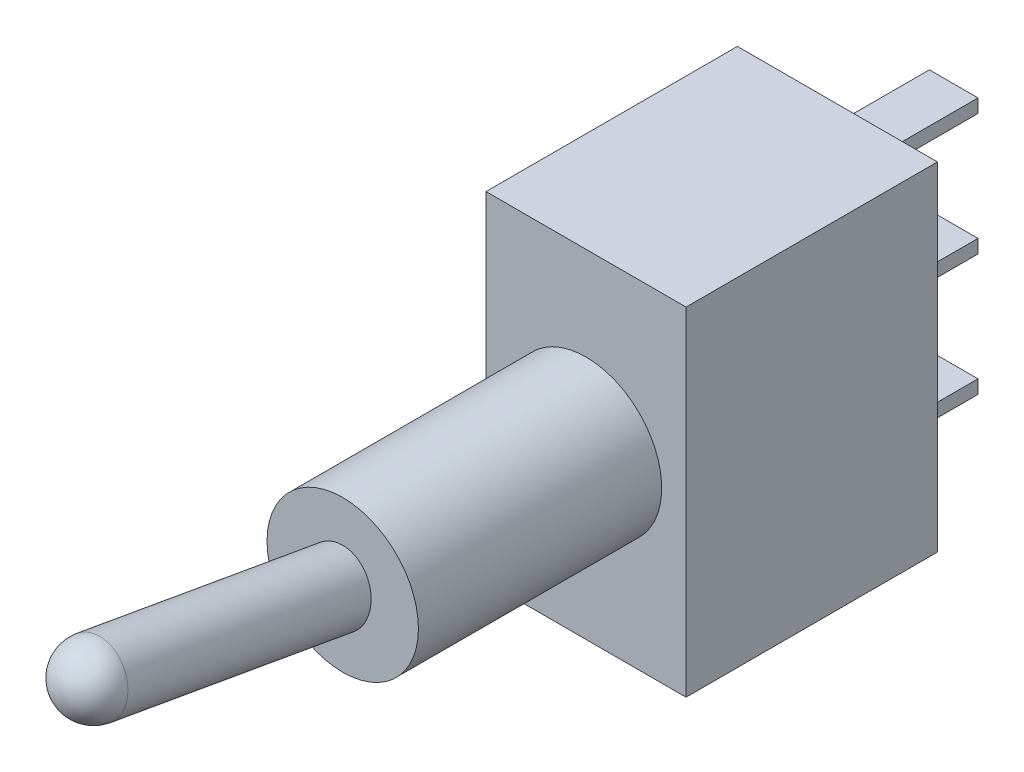
ISO-10303-21;
HEADER;
FILE_DESCRIPTION(('STEP AP214'),'2;1');
FILE_NAME('part.step','',(''),(''),'','','');
FILE_SCHEMA(('AUTOMOTIVE_DESIGN { 1 0 10303 214 1 1 1 1 }'));
ENDSEC;
DATA;
#1=APPLICATION_CONTEXT('core data for automotive mechanical design processes');
#2=APPLICATION_PROTOCOL_DEFINITION('international standard','automotive_design',2000,#1);
#3=PRODUCT_CONTEXT('',#1,'mechanical');
#4=PRODUCT('Part','Part','',(#3));
#5=PRODUCT_RELATED_PRODUCT_CATEGORY('part','',(#4));
#6=PRODUCT_DEFINITION_FORMATION('','',#4);
#7=PRODUCT_DEFINITION_CONTEXT('part definition',#1,'design');
#8=PRODUCT_DEFINITION('design','',#6,#7);
#9=PRODUCT_DEFINITION_SHAPE('','',#8);
#10=(LENGTH_UNIT() NAMED_UNIT(*) SI_UNIT(.MILLI.,.METRE.));
#11=(NAMED_UNIT(*) PLANE_ANGLE_UNIT() SI_UNIT($,.RADIAN.));
#12=(NAMED_UNIT(*) SI_UNIT($,.STERADIAN.) SOLID_ANGLE_UNIT());
#13=UNCERTAINTY_MEASURE_WITH_UNIT(LENGTH_MEASURE(1.E-05),#10,'distance_accuracy_value','');
#14=(GEOMETRIC_REPRESENTATION_CONTEXT(3) GLOBAL_UNCERTAINTY_ASSIGNED_CONTEXT((#13)) GLOBAL_UNIT_ASSIGNED_CONTEXT((#10,
#11,#12)) REPRESENTATION_CONTEXT('',''));
#15=CARTESIAN_POINT('',(0.,0.,0.));
#16=DIRECTION('',(0.,0.,1.));
#17=DIRECTION('',(1.,0.,0.));
#18=AXIS2_PLACEMENT_3D('',#15,#16,#17);
#19=CARTESIAN_POINT('',(3.7,6.25,18.3));
#20=DIRECTION('',(0.,0.173648177666931,0.984807753012208));
#21=DIRECTION('',(0.,-0.984807753012208,0.173648177666931));
#22=AXIS2_PLACEMENT_3D('',#19,#20,#21);
#23=CONICAL_SURFACE('',#22,0.,1.39626340159546);
#24=CARTESIAN_POINT('',(3.7,6.28827357359192,18.5170602220837));
#25=DIRECTION('',(0.,-0.173648177666931,-0.984807753012208));
#26=DIRECTION('',(0.,0.984807753012208,-0.173648177666931));
#27=AXIS2_PLACEMENT_3D('',#24,#25,#26);
#28=CIRCLE('',#27,1.25);
#29=CARTESIAN_POINT('',(3.7,7.51928326485718,18.3));
#30=VERTEX_POINT('',#29);
#31=EDGE_CURVE('E12',#30,#30,#28,.T.);
#32=ORIENTED_EDGE('',*,*,#31,.T.);
#33=EDGE_LOOP('',(#32));
#34=FACE_BOUND('',#33,.T.);
#35=CARTESIAN_POINT('',(3.7,6.25,18.3));
#36=VERTEX_POINT('',#35);
#37=VERTEX_LOOP('',#36);
#38=FACE_BOUND('',#37,.T.);
#39=ADVANCED_FACE('F42',(#34,#38),#23,.T.);
#40=CARTESIAN_POINT('',(3.7,6.25,18.3));
#41=DIRECTION('',(0.,-0.173648177666931,-0.984807753012208));
#42=DIRECTION('',(0.,0.984807753012208,-0.173648177666931));
#43=AXIS2_PLACEMENT_3D('',#40,#41,#42);
#44=CYLINDRICAL_SURFACE('',#43,1.25);
#45=CARTESIAN_POINT('',(3.7,7.87521639996811,27.5170602220837));
#46=DIRECTION('',(0.,-0.173648177666931,-0.984807753012208));
#47=DIRECTION('',(0.,0.984807753012208,-0.173648177666931));
#48=AXIS2_PLACEMENT_3D('',#45,#46,#47);
#49=CIRCLE('',#48,1.25);
#50=CARTESIAN_POINT('',(3.7,9.10622609123337,27.3));
#51=VERTEX_POINT('',#50);
#52=EDGE_CURVE('E48',#51,#51,#49,.T.);
#53=ORIENTED_EDGE('',*,*,#52,.T.);
#54=EDGE_LOOP('',(#53));
#55=FACE_BOUND('',#54,.T.);
#56=ORIENTED_EDGE('',*,*,#31,.F.);
#57=EDGE_LOOP('',(#56));
#58=FACE_BOUND('',#57,.T.);
#59=ADVANCED_FACE('F52',(#55,#58),#44,.T.);
#60=CARTESIAN_POINT('',(3.7,7.87521639996811,27.5170602220837));
#61=DIRECTION('',(0.,-0.173648177666931,-0.984807753012208));
#62=DIRECTION('',(0.,0.984807753012208,-0.173648177666931));
#63=AXIS2_PLACEMENT_3D('',#60,#61,#62);
#64=SPHERICAL_SURFACE('',#63,1.25);
#65=ORIENTED_EDGE('',*,*,#52,.F.);
#66=EDGE_LOOP('',(#65));
#67=FACE_BOUND('',#66,.T.);
#68=ADVANCED_FACE('F57',(#67),#64,.T.);
#69=CLOSED_SHELL('',(#39,#59,#68));
#70=MANIFOLD_SOLID_BREP('B2',#69);
#71=CARTESIAN_POINT('',(0.,0.,9.3));
#72=DIRECTION('',(0.,0.,-1.));
#73=DIRECTION('',(-1.,0.,0.));
#74=AXIS2_PLACEMENT_3D('',#71,#72,#73);
#75=PLANE('',#74);
#76=DIRECTION('',(0.,-1.,0.));
#77=VECTOR('',#76,1.);
#78=CARTESIAN_POINT('',(0.,0.,9.3));
#79=LINE('',#78,#77);
#80=CARTESIAN_POINT('',(0.,12.5,9.3));
#81=VERTEX_POINT('',#80);
#82=CARTESIAN_POINT('',(0.,0.,9.3));
#83=VERTEX_POINT('',#82);
#84=EDGE_CURVE('E284',#81,#83,#79,.T.);
#85=ORIENTED_EDGE('',*,*,#84,.T.);
#86=DIRECTION('',(1.,0.,0.));
#87=VECTOR('',#86,1.);
#88=CARTESIAN_POINT('',(0.,0.,9.3));
#89=LINE('',#88,#87);
#90=CARTESIAN_POINT('',(7.4,0.,9.3));
#91=VERTEX_POINT('',#90);
#92=EDGE_CURVE('E287',#83,#91,#89,.T.);
#93=ORIENTED_EDGE('',*,*,#92,.T.);
#94=DIRECTION('',(0.,1.,0.));
#95=VECTOR('',#94,1.);
#96=CARTESIAN_POINT('',(7.4,0.,9.3));
#97=LINE('',#96,#95);
#98=CARTESIAN_POINT('',(7.4,12.5,9.3));
#99=VERTEX_POINT('',#98);
#100=EDGE_CURVE('E290',#91,#99,#97,.T.);
#101=ORIENTED_EDGE('',*,*,#100,.T.);
#102=DIRECTION('',(-1.,0.,0.));
#103=VECTOR('',#102,1.);
#104=CARTESIAN_POINT('',(0.,12.5,9.3));
#105=LINE('',#104,#103);
#106=EDGE_CURVE('E292',#99,#81,#105,.T.);
#107=ORIENTED_EDGE('',*,*,#106,.T.);
#108=EDGE_LOOP('',(#85,#93,#101,#107));
#109=FACE_BOUND('',#108,.T.);
#110=CARTESIAN_POINT('',(3.7,6.25,9.3));
#111=DIRECTION('',(0.,0.,-1.));
#112=DIRECTION('',(-1.,0.,0.));
#113=AXIS2_PLACEMENT_3D('',#110,#111,#112);
#114=CIRCLE('',#113,2.8);
#115=CARTESIAN_POINT('',(0.9,6.25,9.3));
#116=VERTEX_POINT('',#115);
#117=EDGE_CURVE('E40',#116,#116,#114,.F.);
#118=ORIENTED_EDGE('',*,*,#117,.F.);
#119=EDGE_LOOP('',(#118));
#120=FACE_BOUND('',#119,.T.);
#121=ADVANCED_FACE('F84',(#109,#120),#75,.F.);
#122=CARTESIAN_POINT('',(0.,0.,0.));
#123=DIRECTION('',(0.,0.,-1.));
#124=DIRECTION('',(-1.,0.,0.));
#125=AXIS2_PLACEMENT_3D('',#122,#123,#124);
#126=PLANE('',#125);
#127=DIRECTION('',(1.,0.,0.));
#128=VECTOR('',#127,1.);
#129=CARTESIAN_POINT('',(2.8,6.5,0.));
#130=LINE('',#129,#128);
#131=CARTESIAN_POINT('',(2.8,6.5,0.));
#132=VERTEX_POINT('',#131);
#133=CARTESIAN_POINT('',(4.6,6.5,0.));
#134=VERTEX_POINT('',#133);
#135=EDGE_CURVE('E226',#132,#134,#130,.T.);
#136=ORIENTED_EDGE('',*,*,#135,.F.);
#137=DIRECTION('',(0.,1.,0.));
#138=VECTOR('',#137,1.);
#139=CARTESIAN_POINT('',(2.8,6.,0.));
#140=LINE('',#139,#138);
#141=CARTESIAN_POINT('',(2.8,6.,0.));
#142=VERTEX_POINT('',#141);
#143=EDGE_CURVE('E223',#142,#132,#140,.T.);
#144=ORIENTED_EDGE('',*,*,#143,.F.);
#145=DIRECTION('',(-1.,0.,0.));
#146=VECTOR('',#145,1.);
#147=CARTESIAN_POINT('',(2.8,6.,0.));
#148=LINE('',#147,#146);
#149=CARTESIAN_POINT('',(4.6,6.,0.));
#150=VERTEX_POINT('',#149);
#151=EDGE_CURVE('E235',#150,#142,#148,.T.);
#152=ORIENTED_EDGE('',*,*,#151,.F.);
#153=DIRECTION('',(0.,-1.,0.));
#154=VECTOR('',#153,1.);
#155=CARTESIAN_POINT('',(4.6,6.,0.));
#156=LINE('',#155,#154);
#157=EDGE_CURVE('E243',#134,#150,#156,.T.);
#158=ORIENTED_EDGE('',*,*,#157,.F.);
#159=EDGE_LOOP('',(#136,#144,#152,#158));
#160=FACE_BOUND('',#159,.T.);
#161=DIRECTION('',(0.,-1.,0.));
#162=VECTOR('',#161,1.);
#163=CARTESIAN_POINT('',(0.,0.,0.));
#164=LINE('',#163,#162);
#165=CARTESIAN_POINT('',(0.,12.5,0.));
#166=VERTEX_POINT('',#165);
#167=CARTESIAN_POINT('',(0.,0.,0.));
#168=VERTEX_POINT('',#167);
#169=EDGE_CURVE('E283',#166,#168,#164,.T.);
#170=ORIENTED_EDGE('',*,*,#169,.F.);
#171=DIRECTION('',(-1.,0.,0.));
#172=VECTOR('',#171,1.);
#173=CARTESIAN_POINT('',(0.,12.5,0.));
#174=LINE('',#173,#172);
#175=CARTESIAN_POINT('',(7.4,12.5,0.));
#176=VERTEX_POINT('',#175);
#177=EDGE_CURVE('E288',#176,#166,#174,.T.);
#178=ORIENTED_EDGE('',*,*,#177,.F.);
#179=DIRECTION('',(0.,1.,0.));
#180=VECTOR('',#179,1.);
#181=CARTESIAN_POINT('',(7.4,0.,0.));
#182=LINE('',#181,#180);
#183=CARTESIAN_POINT('',(7.4,0.,0.));
#184=VERTEX_POINT('',#183);
#185=EDGE_CURVE('E299',#184,#176,#182,.T.);
#186=ORIENTED_EDGE('',*,*,#185,.F.);
#187=DIRECTION('',(1.,0.,0.));
#188=VECTOR('',#187,1.);
#189=CARTESIAN_POINT('',(0.,0.,0.));
#190=LINE('',#189,#188);
#191=EDGE_CURVE('E297',#168,#184,#190,.T.);
#192=ORIENTED_EDGE('',*,*,#191,.F.);
#193=EDGE_LOOP('',(#170,#178,#186,#192));
#194=FACE_BOUND('',#193,.T.);
#195=DIRECTION('',(1.,0.,0.));
#196=VECTOR('',#195,1.);
#197=CARTESIAN_POINT('',(2.8,2.,0.));
#198=LINE('',#197,#196);
#199=CARTESIAN_POINT('',(2.8,2.,0.));
#200=VERTEX_POINT('',#199);
#201=CARTESIAN_POINT('',(4.6,2.,0.));
#202=VERTEX_POINT('',#201);
#203=EDGE_CURVE('E268',#200,#202,#198,.T.);
#204=ORIENTED_EDGE('',*,*,#203,.F.);
#205=DIRECTION('',(0.,1.,0.));
#206=VECTOR('',#205,1.);
#207=CARTESIAN_POINT('',(2.8,1.5,0.));
#208=LINE('',#207,#206);
#209=CARTESIAN_POINT('',(2.8,1.5,0.));
#210=VERTEX_POINT('',#209);
#211=EDGE_CURVE('E254',#210,#200,#208,.T.);
#212=ORIENTED_EDGE('',*,*,#211,.F.);
#213=DIRECTION('',(-1.,0.,0.));
#214=VECTOR('',#213,1.);
#215=CARTESIAN_POINT('',(2.8,1.5,0.));
#216=LINE('',#215,#214);
#217=CARTESIAN_POINT('',(4.6,1.5,0.));
#218=VERTEX_POINT('',#217);
#219=EDGE_CURVE('E259',#218,#210,#216,.T.);
#220=ORIENTED_EDGE('',*,*,#219,.F.);
#221=DIRECTION('',(0.,-1.,0.));
#222=VECTOR('',#221,1.);
#223=CARTESIAN_POINT('',(4.6,1.5,0.));
#224=LINE('',#223,#222);
#225=EDGE_CURVE('E270',#202,#218,#224,.T.);
#226=ORIENTED_EDGE('',*,*,#225,.F.);
#227=EDGE_LOOP('',(#204,#212,#220,#226));
#228=FACE_BOUND('',#227,.T.);
#229=DIRECTION('',(1.,0.,0.));
#230=VECTOR('',#229,1.);
#231=CARTESIAN_POINT('',(2.8,11.,0.));
#232=LINE('',#231,#230);
#233=CARTESIAN_POINT('',(2.8,11.,0.));
#234=VERTEX_POINT('',#233);
#235=CARTESIAN_POINT('',(4.6,11.,0.));
#236=VERTEX_POINT('',#235);
#237=EDGE_CURVE('E566',#234,#236,#232,.T.);
#238=ORIENTED_EDGE('',*,*,#237,.F.);
#239=DIRECTION('',(0.,1.,0.));
#240=VECTOR('',#239,1.);
#241=CARTESIAN_POINT('',(2.8,10.5,0.));
#242=LINE('',#241,#240);
#243=CARTESIAN_POINT('',(2.8,10.5,0.));
#244=VERTEX_POINT('',#243);
#245=EDGE_CURVE('E221',#244,#234,#242,.T.);
#246=ORIENTED_EDGE('',*,*,#245,.F.);
#247=DIRECTION('',(-1.,0.,0.));
#248=VECTOR('',#247,1.);
#249=CARTESIAN_POINT('',(2.8,10.5,0.));
#250=LINE('',#249,#248);
#251=CARTESIAN_POINT('',(4.6,10.5,0.));
#252=VERTEX_POINT('',#251);
#253=EDGE_CURVE('E217',#252,#244,#250,.T.);
#254=ORIENTED_EDGE('',*,*,#253,.F.);
#255=DIRECTION('',(0.,-1.,0.));
#256=VECTOR('',#255,1.);
#257=CARTESIAN_POINT('',(4.6,10.5,0.));
#258=LINE('',#257,#256);
#259=EDGE_CURVE('E568',#236,#252,#258,.T.);
#260=ORIENTED_EDGE('',*,*,#259,.F.);
#261=EDGE_LOOP('',(#238,#246,#254,#260));
#262=FACE_BOUND('',#261,.T.);
#263=ADVANCED_FACE('F320',(#160,#194,#228,#262),#126,.T.);
#264=CARTESIAN_POINT('',(0.,0.,9.3));
#265=DIRECTION('',(1.,0.,0.));
#266=DIRECTION('',(0.,0.,-1.));
#267=AXIS2_PLACEMENT_3D('',#264,#265,#266);
#268=PLANE('',#267);
#269=ORIENTED_EDGE('',*,*,#169,.T.);
#270=DIRECTION('',(0.,0.,-1.));
#271=VECTOR('',#270,1.);
#272=CARTESIAN_POINT('',(0.,0.,9.3));
#273=LINE('',#272,#271);
#274=EDGE_CURVE('E92',#83,#168,#273,.T.);
#275=ORIENTED_EDGE('',*,*,#274,.F.);
#276=ORIENTED_EDGE('',*,*,#84,.F.);
#277=DIRECTION('',(0.,0.,-1.));
#278=VECTOR('',#277,1.);
#279=CARTESIAN_POINT('',(0.,12.5,9.3));
#280=LINE('',#279,#278);
#281=EDGE_CURVE('E294',#81,#166,#280,.T.);
#282=ORIENTED_EDGE('',*,*,#281,.T.);
#283=EDGE_LOOP('',(#269,#275,#276,#282));
#284=FACE_BOUND('',#283,.T.);
#285=ADVANCED_FACE('F86',(#284),#268,.F.);
#286=CARTESIAN_POINT('',(0.,0.,9.3));
#287=DIRECTION('',(0.,1.,0.));
#288=DIRECTION('',(0.,0.,1.));
#289=AXIS2_PLACEMENT_3D('',#286,#287,#288);
#290=PLANE('',#289);
#291=ORIENTED_EDGE('',*,*,#191,.T.);
#292=DIRECTION('',(0.,0.,-1.));
#293=VECTOR('',#292,1.);
#294=CARTESIAN_POINT('',(7.4,0.,9.3));
#295=LINE('',#294,#293);
#296=EDGE_CURVE('E307',#91,#184,#295,.T.);
#297=ORIENTED_EDGE('',*,*,#296,.F.);
#298=ORIENTED_EDGE('',*,*,#92,.F.);
#299=ORIENTED_EDGE('',*,*,#274,.T.);
#300=EDGE_LOOP('',(#291,#297,#298,#299));
#301=FACE_BOUND('',#300,.T.);
#302=ADVANCED_FACE('F312',(#301),#290,.F.);
#303=CARTESIAN_POINT('',(7.4,0.,9.3));
#304=DIRECTION('',(-1.,0.,0.));
#305=DIRECTION('',(0.,0.,1.));
#306=AXIS2_PLACEMENT_3D('',#303,#304,#305);
#307=PLANE('',#306);
#308=ORIENTED_EDGE('',*,*,#185,.T.);
#309=DIRECTION('',(0.,0.,-1.));
#310=VECTOR('',#309,1.);
#311=CARTESIAN_POINT('',(7.4,12.5,9.3));
#312=LINE('',#311,#310);
#313=EDGE_CURVE('E304',#99,#176,#312,.T.);
#314=ORIENTED_EDGE('',*,*,#313,.F.);
#315=ORIENTED_EDGE('',*,*,#100,.F.);
#316=ORIENTED_EDGE('',*,*,#296,.T.);
#317=EDGE_LOOP('',(#308,#314,#315,#316));
#318=FACE_BOUND('',#317,.T.);
#319=ADVANCED_FACE('F325',(#318),#307,.F.);
#320=CARTESIAN_POINT('',(0.,12.5,9.3));
#321=DIRECTION('',(0.,-1.,0.));
#322=DIRECTION('',(0.,0.,-1.));
#323=AXIS2_PLACEMENT_3D('',#320,#321,#322);
#324=PLANE('',#323);
#325=ORIENTED_EDGE('',*,*,#177,.T.);
#326=ORIENTED_EDGE('',*,*,#281,.F.);
#327=ORIENTED_EDGE('',*,*,#106,.F.);
#328=ORIENTED_EDGE('',*,*,#313,.T.);
#329=EDGE_LOOP('',(#325,#326,#327,#328));
#330=FACE_BOUND('',#329,.T.);
#331=ADVANCED_FACE('F329',(#330),#324,.F.);
#332=CARTESIAN_POINT('',(2.8,1.5,-4.3));
#333=DIRECTION('',(1.,0.,0.));
#334=DIRECTION('',(0.,1.,0.));
#335=AXIS2_PLACEMENT_3D('',#332,#333,#334);
#336=PLANE('',#335);
#337=ORIENTED_EDGE('',*,*,#211,.T.);
#338=DIRECTION('',(0.,0.,1.));
#339=VECTOR('',#338,1.);
#340=CARTESIAN_POINT('',(2.8,2.,-4.3));
#341=LINE('',#340,#339);
#342=CARTESIAN_POINT('',(2.8,2.,-4.3));
#343=VERTEX_POINT('',#342);
#344=EDGE_CURVE('E281',#343,#200,#341,.T.);
#345=ORIENTED_EDGE('',*,*,#344,.F.);
#346=DIRECTION('',(0.,1.,0.));
#347=VECTOR('',#346,1.);
#348=CARTESIAN_POINT('',(2.8,1.5,-4.3));
#349=LINE('',#348,#347);
#350=CARTESIAN_POINT('',(2.8,1.5,-4.3));
#351=VERTEX_POINT('',#350);
#352=EDGE_CURVE('E255',#351,#343,#349,.T.);
#353=ORIENTED_EDGE('',*,*,#352,.F.);
#354=DIRECTION('',(0.,0.,1.));
#355=VECTOR('',#354,1.);
#356=CARTESIAN_POINT('',(2.8,1.5,-4.3));
#357=LINE('',#356,#355);
#358=EDGE_CURVE('E265',#351,#210,#357,.T.);
#359=ORIENTED_EDGE('',*,*,#358,.T.);
#360=EDGE_LOOP('',(#337,#345,#353,#359));
#361=FACE_BOUND('',#360,.T.);
#362=ADVANCED_FACE('F395',(#361),#336,.F.);
#363=CARTESIAN_POINT('',(2.8,2.,-4.3));
#364=DIRECTION('',(0.,-1.,0.));
#365=DIRECTION('',(1.,0.,0.));
#366=AXIS2_PLACEMENT_3D('',#363,#364,#365);
#367=PLANE('',#366);
#368=ORIENTED_EDGE('',*,*,#203,.T.);
#369=DIRECTION('',(0.,0.,1.));
#370=VECTOR('',#369,1.);
#371=CARTESIAN_POINT('',(4.6,2.,-4.3));
#372=LINE('',#371,#370);
#373=CARTESIAN_POINT('',(4.6,2.,-4.3));
#374=VERTEX_POINT('',#373);
#375=EDGE_CURVE('E278',#374,#202,#372,.T.);
#376=ORIENTED_EDGE('',*,*,#375,.F.);
#377=DIRECTION('',(1.,0.,0.));
#378=VECTOR('',#377,1.);
#379=CARTESIAN_POINT('',(2.8,2.,-4.3));
#380=LINE('',#379,#378);
#381=EDGE_CURVE('E258',#343,#374,#380,.T.);
#382=ORIENTED_EDGE('',*,*,#381,.F.);
#383=ORIENTED_EDGE('',*,*,#344,.T.);
#384=EDGE_LOOP('',(#368,#376,#382,#383));
#385=FACE_BOUND('',#384,.T.);
#386=ADVANCED_FACE('F391',(#385),#367,.F.);
#387=CARTESIAN_POINT('',(4.6,1.5,-4.3));
#388=DIRECTION('',(-1.,0.,0.));
#389=DIRECTION('',(0.,-1.,0.));
#390=AXIS2_PLACEMENT_3D('',#387,#388,#389);
#391=PLANE('',#390);
#392=ORIENTED_EDGE('',*,*,#225,.T.);
#393=DIRECTION('',(0.,0.,1.));
#394=VECTOR('',#393,1.);
#395=CARTESIAN_POINT('',(4.6,1.5,-4.3));
#396=LINE('',#395,#394);
#397=CARTESIAN_POINT('',(4.6,1.5,-4.3));
#398=VERTEX_POINT('',#397);
#399=EDGE_CURVE('E276',#398,#218,#396,.T.);
#400=ORIENTED_EDGE('',*,*,#399,.F.);
#401=DIRECTION('',(0.,-1.,0.));
#402=VECTOR('',#401,1.);
#403=CARTESIAN_POINT('',(4.6,1.5,-4.3));
#404=LINE('',#403,#402);
#405=EDGE_CURVE('E261',#374,#398,#404,.T.);
#406=ORIENTED_EDGE('',*,*,#405,.F.);
#407=ORIENTED_EDGE('',*,*,#375,.T.);
#408=EDGE_LOOP('',(#392,#400,#406,#407));
#409=FACE_BOUND('',#408,.T.);
#410=ADVANCED_FACE('F387',(#409),#391,.F.);
#411=CARTESIAN_POINT('',(2.8,1.5,-4.3));
#412=DIRECTION('',(0.,1.,0.));
#413=DIRECTION('',(-1.,0.,0.));
#414=AXIS2_PLACEMENT_3D('',#411,#412,#413);
#415=PLANE('',#414);
#416=ORIENTED_EDGE('',*,*,#219,.T.);
#417=ORIENTED_EDGE('',*,*,#358,.F.);
#418=DIRECTION('',(-1.,0.,0.));
#419=VECTOR('',#418,1.);
#420=CARTESIAN_POINT('',(2.8,1.5,-4.3));
#421=LINE('',#420,#419);
#422=EDGE_CURVE('E263',#398,#351,#421,.T.);
#423=ORIENTED_EDGE('',*,*,#422,.F.);
#424=ORIENTED_EDGE('',*,*,#399,.T.);
#425=EDGE_LOOP('',(#416,#417,#423,#424));
#426=FACE_BOUND('',#425,.T.);
#427=ADVANCED_FACE('F383',(#426),#415,.F.);
#428=CARTESIAN_POINT('',(0.,0.,-4.3));
#429=DIRECTION('',(0.,0.,-1.));
#430=DIRECTION('',(-1.,0.,0.));
#431=AXIS2_PLACEMENT_3D('',#428,#429,#430);
#432=PLANE('',#431);
#433=ORIENTED_EDGE('',*,*,#352,.T.);
#434=ORIENTED_EDGE('',*,*,#381,.T.);
#435=ORIENTED_EDGE('',*,*,#405,.T.);
#436=ORIENTED_EDGE('',*,*,#422,.T.);
#437=EDGE_LOOP('',(#433,#434,#435,#436));
#438=FACE_BOUND('',#437,.T.);
#439=ADVANCED_FACE('F379',(#438),#432,.T.);
#440=CARTESIAN_POINT('',(2.8,6.,-4.3));
#441=DIRECTION('',(1.,0.,0.));
#442=DIRECTION('',(0.,0.,-1.));
#443=AXIS2_PLACEMENT_3D('',#440,#441,#442);
#444=PLANE('',#443);
#445=ORIENTED_EDGE('',*,*,#143,.T.);
#446=DIRECTION('',(0.,0.,1.));
#447=VECTOR('',#446,1.);
#448=CARTESIAN_POINT('',(2.8,6.5,-4.3));
#449=LINE('',#448,#447);
#450=CARTESIAN_POINT('',(2.8,6.5,-4.3));
#451=VERTEX_POINT('',#450);
#452=EDGE_CURVE('E252',#451,#132,#449,.T.);
#453=ORIENTED_EDGE('',*,*,#452,.F.);
#454=DIRECTION('',(0.,1.,0.));
#455=VECTOR('',#454,1.);
#456=CARTESIAN_POINT('',(2.8,6.,-4.3));
#457=LINE('',#456,#455);
#458=CARTESIAN_POINT('',(2.8,6.,-4.3));
#459=VERTEX_POINT('',#458);
#460=EDGE_CURVE('E231',#459,#451,#457,.T.);
#461=ORIENTED_EDGE('',*,*,#460,.F.);
#462=DIRECTION('',(0.,0.,1.));
#463=VECTOR('',#462,1.);
#464=CARTESIAN_POINT('',(2.8,6.,-4.3));
#465=LINE('',#464,#463);
#466=EDGE_CURVE('E240',#459,#142,#465,.T.);
#467=ORIENTED_EDGE('',*,*,#466,.T.);
#468=EDGE_LOOP('',(#445,#453,#461,#467));
#469=FACE_BOUND('',#468,.T.);
#470=ADVANCED_FACE('F375',(#469),#444,.F.);
#471=CARTESIAN_POINT('',(2.8,6.5,-4.3));
#472=DIRECTION('',(0.,-1.,0.));
#473=DIRECTION('',(0.,0.,-1.));
#474=AXIS2_PLACEMENT_3D('',#471,#472,#473);
#475=PLANE('',#474);
#476=ORIENTED_EDGE('',*,*,#135,.T.);
#477=DIRECTION('',(0.,0.,1.));
#478=VECTOR('',#477,1.);
#479=CARTESIAN_POINT('',(4.6,6.5,-4.3));
#480=LINE('',#479,#478);
#481=CARTESIAN_POINT('',(4.6,6.5,-4.3));
#482=VERTEX_POINT('',#481);
#483=EDGE_CURVE('E249',#482,#134,#480,.T.);
#484=ORIENTED_EDGE('',*,*,#483,.F.);
#485=DIRECTION('',(1.,0.,0.));
#486=VECTOR('',#485,1.);
#487=CARTESIAN_POINT('',(2.8,6.5,-4.3));
#488=LINE('',#487,#486);
#489=EDGE_CURVE('E234',#451,#482,#488,.T.);
#490=ORIENTED_EDGE('',*,*,#489,.F.);
#491=ORIENTED_EDGE('',*,*,#452,.T.);
#492=EDGE_LOOP('',(#476,#484,#490,#491));
#493=FACE_BOUND('',#492,.T.);
#494=ADVANCED_FACE('F371',(#493),#475,.F.);
#495=CARTESIAN_POINT('',(4.6,6.,-4.3));
#496=DIRECTION('',(-1.,0.,0.));
#497=DIRECTION('',(0.,0.,1.));
#498=AXIS2_PLACEMENT_3D('',#495,#496,#497);
#499=PLANE('',#498);
#500=ORIENTED_EDGE('',*,*,#157,.T.);
#501=DIRECTION('',(0.,0.,1.));
#502=VECTOR('',#501,1.);
#503=CARTESIAN_POINT('',(4.6,6.,-4.3));
#504=LINE('',#503,#502);
#505=CARTESIAN_POINT('',(4.6,6.,-4.3));
#506=VERTEX_POINT('',#505);
#507=EDGE_CURVE('E107',#506,#150,#504,.T.);
#508=ORIENTED_EDGE('',*,*,#507,.F.);
#509=DIRECTION('',(0.,-1.,0.));
#510=VECTOR('',#509,1.);
#511=CARTESIAN_POINT('',(4.6,6.,-4.3));
#512=LINE('',#511,#510);
#513=EDGE_CURVE('E237',#482,#506,#512,.T.);
#514=ORIENTED_EDGE('',*,*,#513,.F.);
#515=ORIENTED_EDGE('',*,*,#483,.T.);
#516=EDGE_LOOP('',(#500,#508,#514,#515));
#517=FACE_BOUND('',#516,.T.);
#518=ADVANCED_FACE('F368',(#517),#499,.F.);
#519=CARTESIAN_POINT('',(2.8,6.,-4.3));
#520=DIRECTION('',(0.,1.,0.));
#521=DIRECTION('',(0.,0.,1.));
#522=AXIS2_PLACEMENT_3D('',#519,#520,#521);
#523=PLANE('',#522);
#524=ORIENTED_EDGE('',*,*,#151,.T.);
#525=ORIENTED_EDGE('',*,*,#466,.F.);
#526=DIRECTION('',(-1.,0.,0.));
#527=VECTOR('',#526,1.);
#528=CARTESIAN_POINT('',(2.8,6.,-4.3));
#529=LINE('',#528,#527);
#530=EDGE_CURVE('E239',#506,#459,#529,.T.);
#531=ORIENTED_EDGE('',*,*,#530,.F.);
#532=ORIENTED_EDGE('',*,*,#507,.T.);
#533=EDGE_LOOP('',(#524,#525,#531,#532));
#534=FACE_BOUND('',#533,.T.);
#535=ADVANCED_FACE('F364',(#534),#523,.F.);
#536=CARTESIAN_POINT('',(0.,0.,-4.3));
#537=DIRECTION('',(0.,0.,-1.));
#538=DIRECTION('',(-1.,0.,0.));
#539=AXIS2_PLACEMENT_3D('',#536,#537,#538);
#540=PLANE('',#539);
#541=ORIENTED_EDGE('',*,*,#460,.T.);
#542=ORIENTED_EDGE('',*,*,#489,.T.);
#543=ORIENTED_EDGE('',*,*,#513,.T.);
#544=ORIENTED_EDGE('',*,*,#530,.T.);
#545=EDGE_LOOP('',(#541,#542,#543,#544));
#546=FACE_BOUND('',#545,.T.);
#547=ADVANCED_FACE('F361',(#546),#540,.T.);
#548=CARTESIAN_POINT('',(2.8,10.5,-4.3));
#549=DIRECTION('',(1.,0.,0.));
#550=DIRECTION('',(0.,0.,-1.));
#551=AXIS2_PLACEMENT_3D('',#548,#549,#550);
#552=PLANE('',#551);
#553=ORIENTED_EDGE('',*,*,#245,.T.);
#554=DIRECTION('',(0.,0.,1.));
#555=VECTOR('',#554,1.);
#556=CARTESIAN_POINT('',(2.8,11.,-4.3));
#557=LINE('',#556,#555);
#558=CARTESIAN_POINT('',(2.8,11.,-4.3));
#559=VERTEX_POINT('',#558);
#560=EDGE_CURVE('E202',#559,#234,#557,.T.);
#561=ORIENTED_EDGE('',*,*,#560,.F.);
#562=DIRECTION('',(0.,1.,0.));
#563=VECTOR('',#562,1.);
#564=CARTESIAN_POINT('',(2.8,10.5,-4.3));
#565=LINE('',#564,#563);
#566=CARTESIAN_POINT('',(2.8,10.5,-4.3));
#567=VERTEX_POINT('',#566);
#568=EDGE_CURVE('E209',#567,#559,#565,.T.);
#569=ORIENTED_EDGE('',*,*,#568,.F.);
#570=DIRECTION('',(0.,0.,1.));
#571=VECTOR('',#570,1.);
#572=CARTESIAN_POINT('',(2.8,10.5,-4.3));
#573=LINE('',#572,#571);
#574=EDGE_CURVE('E576',#567,#244,#573,.T.);
#575=ORIENTED_EDGE('',*,*,#574,.T.);
#576=EDGE_LOOP('',(#553,#561,#569,#575));
#577=FACE_BOUND('',#576,.T.);
#578=ADVANCED_FACE('F219',(#577),#552,.F.);
#579=CARTESIAN_POINT('',(2.8,11.,-4.3));
#580=DIRECTION('',(0.,-1.,0.));
#581=DIRECTION('',(0.,0.,-1.));
#582=AXIS2_PLACEMENT_3D('',#579,#580,#581);
#583=PLANE('',#582);
#584=ORIENTED_EDGE('',*,*,#237,.T.);
#585=DIRECTION('',(0.,0.,1.));
#586=VECTOR('',#585,1.);
#587=CARTESIAN_POINT('',(4.6,11.,-4.3));
#588=LINE('',#587,#586);
#589=CARTESIAN_POINT('',(4.6,11.,-4.3));
#590=VERTEX_POINT('',#589);
#591=EDGE_CURVE('E205',#590,#236,#588,.T.);
#592=ORIENTED_EDGE('',*,*,#591,.F.);
#593=DIRECTION('',(1.,0.,0.));
#594=VECTOR('',#593,1.);
#595=CARTESIAN_POINT('',(2.8,11.,-4.3));
#596=LINE('',#595,#594);
#597=EDGE_CURVE('E198',#559,#590,#596,.T.);
#598=ORIENTED_EDGE('',*,*,#597,.F.);
#599=ORIENTED_EDGE('',*,*,#560,.T.);
#600=EDGE_LOOP('',(#584,#592,#598,#599));
#601=FACE_BOUND('',#600,.T.);
#602=ADVANCED_FACE('F200',(#601),#583,.F.);
#603=CARTESIAN_POINT('',(4.6,10.5,-4.3));
#604=DIRECTION('',(-1.,0.,0.));
#605=DIRECTION('',(0.,-1.,0.));
#606=AXIS2_PLACEMENT_3D('',#603,#604,#605);
#607=PLANE('',#606);
#608=ORIENTED_EDGE('',*,*,#259,.T.);
#609=DIRECTION('',(0.,0.,1.));
#610=VECTOR('',#609,1.);
#611=CARTESIAN_POINT('',(4.6,10.5,-4.3));
#612=LINE('',#611,#610);
#613=CARTESIAN_POINT('',(4.6,10.5,-4.3));
#614=VERTEX_POINT('',#613);
#615=EDGE_CURVE('E99',#614,#252,#612,.T.);
#616=ORIENTED_EDGE('',*,*,#615,.F.);
#617=DIRECTION('',(0.,-1.,0.));
#618=VECTOR('',#617,1.);
#619=CARTESIAN_POINT('',(4.6,10.5,-4.3));
#620=LINE('',#619,#618);
#621=EDGE_CURVE('E208',#590,#614,#620,.T.);
#622=ORIENTED_EDGE('',*,*,#621,.F.);
#623=ORIENTED_EDGE('',*,*,#591,.T.);
#624=EDGE_LOOP('',(#608,#616,#622,#623));
#625=FACE_BOUND('',#624,.T.);
#626=ADVANCED_FACE('F353',(#625),#607,.F.);
#627=CARTESIAN_POINT('',(2.8,10.5,-4.3));
#628=DIRECTION('',(0.,1.,0.));
#629=DIRECTION('',(-1.,0.,0.));
#630=AXIS2_PLACEMENT_3D('',#627,#628,#629);
#631=PLANE('',#630);
#632=ORIENTED_EDGE('',*,*,#253,.T.);
#633=ORIENTED_EDGE('',*,*,#574,.F.);
#634=DIRECTION('',(-1.,0.,0.));
#635=VECTOR('',#634,1.);
#636=CARTESIAN_POINT('',(2.8,10.5,-4.3));
#637=LINE('',#636,#635);
#638=EDGE_CURVE('E213',#614,#567,#637,.T.);
#639=ORIENTED_EDGE('',*,*,#638,.F.);
#640=ORIENTED_EDGE('',*,*,#615,.T.);
#641=EDGE_LOOP('',(#632,#633,#639,#640));
#642=FACE_BOUND('',#641,.T.);
#643=ADVANCED_FACE('F347',(#642),#631,.F.);
#644=CARTESIAN_POINT('',(0.,0.,-4.3));
#645=DIRECTION('',(0.,0.,-1.));
#646=DIRECTION('',(-1.,0.,0.));
#647=AXIS2_PLACEMENT_3D('',#644,#645,#646);
#648=PLANE('',#647);
#649=ORIENTED_EDGE('',*,*,#568,.T.);
#650=ORIENTED_EDGE('',*,*,#597,.T.);
#651=ORIENTED_EDGE('',*,*,#621,.T.);
#652=ORIENTED_EDGE('',*,*,#638,.T.);
#653=EDGE_LOOP('',(#649,#650,#651,#652));
#654=FACE_BOUND('',#653,.T.);
#655=ADVANCED_FACE('F212',(#654),#648,.T.);
#656=CARTESIAN_POINT('',(3.7,6.25,18.3));
#657=DIRECTION('',(0.,0.,-1.));
#658=DIRECTION('',(-1.,0.,0.));
#659=AXIS2_PLACEMENT_3D('',#656,#657,#658);
#660=CYLINDRICAL_SURFACE('',#659,2.8);
#661=CARTESIAN_POINT('',(3.7,6.25,18.3));
#662=DIRECTION('',(0.,0.,1.));
#663=DIRECTION('',(1.,0.,0.));
#664=AXIS2_PLACEMENT_3D('',#661,#662,#663);
#665=CIRCLE('',#664,2.8);
#666=CARTESIAN_POINT('',(6.5,6.25,18.3));
#667=VERTEX_POINT('',#666);
#668=EDGE_CURVE('E571',#667,#667,#665,.T.);
#669=ORIENTED_EDGE('',*,*,#668,.F.);
#670=EDGE_LOOP('',(#669));
#671=FACE_BOUND('',#670,.T.);
#672=ORIENTED_EDGE('',*,*,#117,.T.);
#673=EDGE_LOOP('',(#672));
#674=FACE_BOUND('',#673,.T.);
#675=ADVANCED_FACE('F336',(#671,#674),#660,.T.);
#676=CARTESIAN_POINT('',(3.7,6.25,18.3));
#677=DIRECTION('',(0.,0.,1.));
#678=DIRECTION('',(1.,0.,0.));
#679=AXIS2_PLACEMENT_3D('',#676,#677,#678);
#680=PLANE('',#679);
#681=ORIENTED_EDGE('',*,*,#668,.T.);
#682=EDGE_LOOP('',(#681));
#683=FACE_BOUND('',#682,.T.);
#684=ADVANCED_FACE('F338',(#683),#680,.T.);
#685=CLOSED_SHELL('',(#121,#263,#285,#302,#319,#331,#362,#386,#410,#427,#439,#470,#494,#518,
#535,#547,#578,#602,#626,#643,#655,#675,#684));
#686=MANIFOLD_SOLID_BREP('B6',#685);
#687=ADVANCED_BREP_SHAPE_REPRESENTATION('',(#18,#70,#686),#14);
#688=SHAPE_DEFINITION_REPRESENTATION(#9,#687);
ENDSEC;
END-ISO-10303-21;
